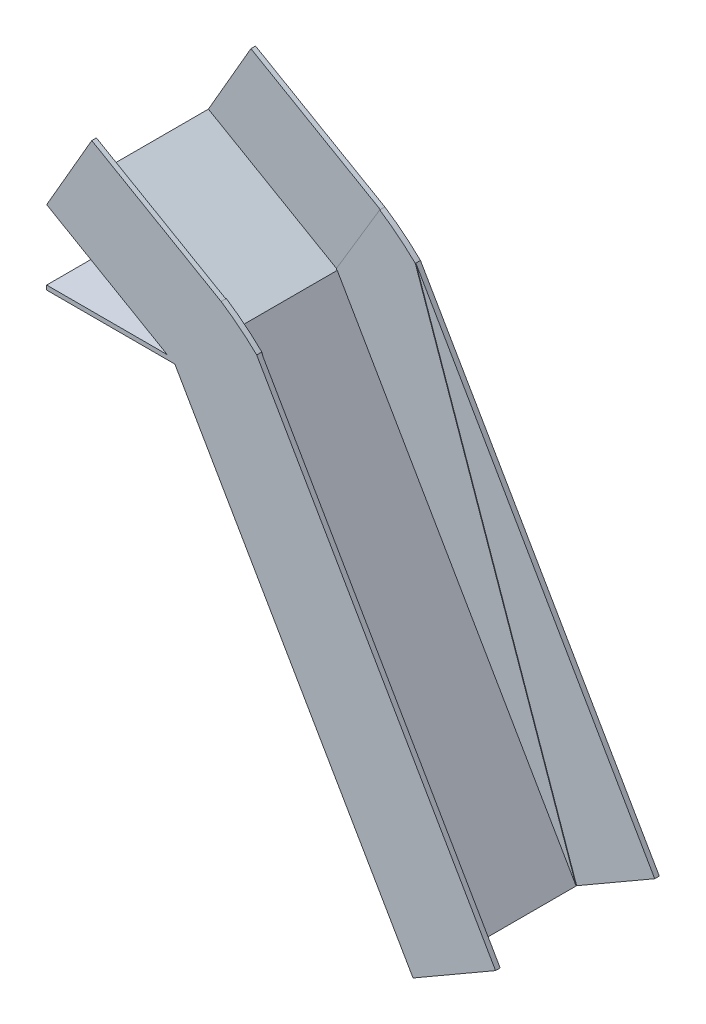
ISO-10303-21;
HEADER;
FILE_DESCRIPTION(('STEP AP214'),'2;1');
FILE_NAME('part.step','',(''),(''),'','','');
FILE_SCHEMA(('AUTOMOTIVE_DESIGN { 1 0 10303 214 1 1 1 1 }'));
ENDSEC;
DATA;
#1=APPLICATION_CONTEXT('core data for automotive mechanical design processes');
#2=APPLICATION_PROTOCOL_DEFINITION('international standard','automotive_design',2000,#1);
#3=PRODUCT_CONTEXT('',#1,'mechanical');
#4=PRODUCT('Part','Part','',(#3));
#5=PRODUCT_RELATED_PRODUCT_CATEGORY('part','',(#4));
#6=PRODUCT_DEFINITION_FORMATION('','',#4);
#7=PRODUCT_DEFINITION_CONTEXT('part definition',#1,'design');
#8=PRODUCT_DEFINITION('design','',#6,#7);
#9=PRODUCT_DEFINITION_SHAPE('','',#8);
#10=(LENGTH_UNIT() NAMED_UNIT(*) SI_UNIT(.MILLI.,.METRE.));
#11=(NAMED_UNIT(*) PLANE_ANGLE_UNIT() SI_UNIT($,.RADIAN.));
#12=(NAMED_UNIT(*) SI_UNIT($,.STERADIAN.) SOLID_ANGLE_UNIT());
#13=UNCERTAINTY_MEASURE_WITH_UNIT(LENGTH_MEASURE(1.E-05),#10,'distance_accuracy_value','');
#14=(GEOMETRIC_REPRESENTATION_CONTEXT(3) GLOBAL_UNCERTAINTY_ASSIGNED_CONTEXT((#13)) GLOBAL_UNIT_ASSIGNED_CONTEXT((#10,
#11,#12)) REPRESENTATION_CONTEXT('',''));
#15=CARTESIAN_POINT('',(0.,0.,0.));
#16=DIRECTION('',(0.,0.,1.));
#17=DIRECTION('',(1.,0.,0.));
#18=AXIS2_PLACEMENT_3D('',#15,#16,#17);
#19=CARTESIAN_POINT('',(78.5519145362399,140.150656940351,-20.291005359564));
#20=DIRECTION('',(-0.500000000000001,0.866025403784438,0.));
#21=DIRECTION('',(-0.866025403784438,-0.500000000000001,0.));
#22=AXIS2_PLACEMENT_3D('',#19,#20,#21);
#23=PLANE('',#22);
#24=DIRECTION('',(-0.866025403784442,-0.499999999999995,0.));
#25=VECTOR('',#24,1.);
#26=CARTESIAN_POINT('',(48.2410254037845,122.650656940351,-20.0797939674139));
#27=LINE('',#26,#25);
#28=CARTESIAN_POINT('',(78.5519145362399,140.150656940351,-20.0797939674139));
#29=VERTEX_POINT('',#28);
#30=CARTESIAN_POINT('',(46.5089745962156,121.650656940351,-20.0797939674139));
#31=VERTEX_POINT('',#30);
#32=EDGE_CURVE('E397',#29,#31,#27,.T.);
#33=ORIENTED_EDGE('',*,*,#32,.F.);
#34=DIRECTION('',(0.,0.,-1.));
#35=VECTOR('',#34,1.);
#36=CARTESIAN_POINT('',(78.5519145362399,140.150656940351,-20.291005359564));
#37=LINE('',#36,#35);
#38=CARTESIAN_POINT('',(78.5519145362399,140.150656940351,-18.291005359564));
#39=VERTEX_POINT('',#38);
#40=EDGE_CURVE('E436',#39,#29,#37,.T.);
#41=ORIENTED_EDGE('',*,*,#40,.F.);
#42=DIRECTION('',(-0.866025403784438,-0.500000000000001,0.));
#43=VECTOR('',#42,1.);
#44=CARTESIAN_POINT('',(78.5519145362399,140.150656940351,-18.291005359564));
#45=LINE('',#44,#43);
#46=CARTESIAN_POINT('',(48.2410254037845,122.650656940351,-18.2910053595639));
#47=VERTEX_POINT('',#46);
#48=EDGE_CURVE('E432',#39,#47,#45,.T.);
#49=ORIENTED_EDGE('',*,*,#48,.T.);
#50=DIRECTION('',(0.,0.,-1.));
#51=VECTOR('',#50,1.);
#52=CARTESIAN_POINT('',(48.2410254037845,122.650656940351,-18.0797939674139));
#53=LINE('',#52,#51);
#54=CARTESIAN_POINT('',(48.2410254037845,122.650656940351,-18.0797939674139));
#55=VERTEX_POINT('',#54);
#56=EDGE_CURVE('E409',#55,#47,#53,.T.);
#57=ORIENTED_EDGE('',*,*,#56,.F.);
#58=DIRECTION('',(0.,0.,-1.));
#59=VECTOR('',#58,1.);
#60=CARTESIAN_POINT('',(48.2410254037845,122.650656940351,41.7107353410038));
#61=LINE('',#60,#59);
#62=CARTESIAN_POINT('',(48.2410254037845,122.650656940351,41.5012646494215));
#63=VERTEX_POINT('',#62);
#64=EDGE_CURVE('E526',#63,#55,#61,.T.);
#65=ORIENTED_EDGE('',*,*,#64,.F.);
#66=CARTESIAN_POINT('',(48.2410254037845,122.650656940351,41.7107353410038));
#67=VERTEX_POINT('',#66);
#68=EDGE_CURVE('E532',#67,#63,#61,.T.);
#69=ORIENTED_EDGE('',*,*,#68,.F.);
#70=DIRECTION('',(-0.866025403784438,-0.500000000000001,0.));
#71=VECTOR('',#70,1.);
#72=CARTESIAN_POINT('',(78.5519145362399,140.150656940351,41.7107353410038));
#73=LINE('',#72,#71);
#74=CARTESIAN_POINT('',(78.5519145362399,140.150656940351,41.7107353410038));
#75=VERTEX_POINT('',#74);
#76=EDGE_CURVE('E308',#75,#67,#73,.T.);
#77=ORIENTED_EDGE('',*,*,#76,.F.);
#78=DIRECTION('',(0.,0.,-1.));
#79=VECTOR('',#78,1.);
#80=CARTESIAN_POINT('',(78.5519145362399,140.150656940351,41.7107353410038));
#81=LINE('',#80,#79);
#82=CARTESIAN_POINT('',(78.5519145362399,140.150656940351,43.5012646494215));
#83=VERTEX_POINT('',#82);
#84=EDGE_CURVE('E305',#83,#75,#81,.T.);
#85=ORIENTED_EDGE('',*,*,#84,.F.);
#86=DIRECTION('',(0.866025403784439,0.5,0.));
#87=VECTOR('',#86,1.);
#88=CARTESIAN_POINT('',(46.5089745962156,121.650656940351,43.5012646494215));
#89=LINE('',#88,#87);
#90=CARTESIAN_POINT('',(46.5089745962156,121.650656940351,43.5012646494215));
#91=VERTEX_POINT('',#90);
#92=EDGE_CURVE('E321',#91,#83,#89,.T.);
#93=ORIENTED_EDGE('',*,*,#92,.F.);
#94=DIRECTION('',(0.,0.,-1.));
#95=VECTOR('',#94,1.);
#96=CARTESIAN_POINT('',(46.5089745962156,121.650656940351,-18.0797939674139));
#97=LINE('',#96,#95);
#98=EDGE_CURVE('E396',#91,#31,#97,.T.);
#99=ORIENTED_EDGE('',*,*,#98,.T.);
#100=EDGE_LOOP('',(#33,#41,#49,#57,#65,#69,#77,#85,#93,#99));
#101=FACE_BOUND('',#100,.T.);
#102=ADVANCED_FACE('F80',(#101),#23,.F.);
#103=CARTESIAN_POINT('',(119.600950535891,69.0516409872319,0.));
#104=DIRECTION('',(-0.866025403784438,-0.500000000000001,0.));
#105=DIRECTION('',(0.500000000000001,-0.866025403784438,0.));
#106=AXIS2_PLACEMENT_3D('',#103,#104,#105);
#107=PLANE('',#106);
#108=DIRECTION('',(0.500000000000001,-0.866025403784438,0.));
#109=VECTOR('',#108,1.);
#110=CARTESIAN_POINT('',(119.600950535891,69.0516409872319,-20.0797939674139));
#111=LINE('',#110,#109);
#112=CARTESIAN_POINT('',(-14.1980854863144,300.798369364335,-20.0797939674139));
#113=VERTEX_POINT('',#112);
#114=EDGE_CURVE('E611',#113,#29,#111,.T.);
#115=ORIENTED_EDGE('',*,*,#114,.F.);
#116=DIRECTION('',(0.,0.,-1.));
#117=VECTOR('',#116,1.);
#118=CARTESIAN_POINT('',(-14.1980854863144,300.798369364335,-18.0797939674139));
#119=LINE('',#118,#117);
#120=CARTESIAN_POINT('',(-14.1980854863144,300.798369364335,-18.2910053595639));
#121=VERTEX_POINT('',#120);
#122=EDGE_CURVE('E420',#121,#113,#119,.T.);
#123=ORIENTED_EDGE('',*,*,#122,.F.);
#124=DIRECTION('',(0.500000000000001,-0.866025403784438,0.));
#125=VECTOR('',#124,1.);
#126=CARTESIAN_POINT('',(-14.1980854637607,300.798369342365,-18.2910053595639));
#127=LINE('',#126,#125);
#128=EDGE_CURVE('E440',#121,#39,#127,.T.);
#129=ORIENTED_EDGE('',*,*,#128,.T.);
#130=ORIENTED_EDGE('',*,*,#40,.T.);
#131=EDGE_LOOP('',(#115,#123,#129,#130));
#132=FACE_BOUND('',#131,.T.);
#133=ADVANCED_FACE('F82',(#132),#107,.F.);
#134=CARTESIAN_POINT('',(-45.9730762113533,283.538488978697,58.5012646494215));
#135=DIRECTION('',(0.,-1.,0.));
#136=DIRECTION('',(0.,0.,-1.));
#137=AXIS2_PLACEMENT_3D('',#134,#135,#136);
#138=PLANE('',#137);
#139=DIRECTION('',(1.,0.,0.));
#140=VECTOR('',#139,1.);
#141=CARTESIAN_POINT('',(-45.9730762113533,283.538488978697,-20.0797939674139));
#142=LINE('',#141,#140);
#143=CARTESIAN_POINT('',(-95.742869732382,283.538488978697,-20.0797939674139));
#144=VERTEX_POINT('',#143);
#145=CARTESIAN_POINT('',(-48.9248740062396,283.538488978697,-20.0797939674139));
#146=VERTEX_POINT('',#145);
#147=EDGE_CURVE('E252',#144,#146,#142,.T.);
#148=ORIENTED_EDGE('',*,*,#147,.F.);
#149=DIRECTION('',(0.,0.,-1.));
#150=VECTOR('',#149,1.);
#151=CARTESIAN_POINT('',(-95.742869732382,283.538488978697,58.5012646494215));
#152=LINE('',#151,#150);
#153=CARTESIAN_POINT('',(-95.742869732382,283.538488978697,43.5012646494215));
#154=VERTEX_POINT('',#153);
#155=EDGE_CURVE('E250',#154,#144,#152,.T.);
#156=ORIENTED_EDGE('',*,*,#155,.F.);
#157=DIRECTION('',(1.,0.,0.));
#158=VECTOR('',#157,1.);
#159=CARTESIAN_POINT('',(-45.9730762113533,283.538488978697,43.5012646494215));
#160=LINE('',#159,#158);
#161=CARTESIAN_POINT('',(-48.9248740062395,283.538488978697,43.5012646494215));
#162=VERTEX_POINT('',#161);
#163=EDGE_CURVE('E265',#154,#162,#160,.T.);
#164=ORIENTED_EDGE('',*,*,#163,.T.);
#165=DIRECTION('',(0.,0.,1.));
#166=VECTOR('',#165,1.);
#167=CARTESIAN_POINT('',(-48.9248740062395,283.538488978697,-18.2892646589962));
#168=LINE('',#167,#166);
#169=EDGE_CURVE('E89',#146,#162,#168,.T.);
#170=ORIENTED_EDGE('',*,*,#169,.F.);
#171=EDGE_LOOP('',(#148,#156,#164,#170));
#172=FACE_BOUND('',#171,.T.);
#173=ADVANCED_FACE('F602',(#172),#138,.F.);
#174=CARTESIAN_POINT('',(-95.742869732382,283.538488978697,58.5012646494215));
#175=DIRECTION('',(1.,0.,0.));
#176=DIRECTION('',(0.,0.,-1.));
#177=AXIS2_PLACEMENT_3D('',#174,#175,#176);
#178=PLANE('',#177);
#179=DIRECTION('',(0.,1.,0.));
#180=VECTOR('',#179,1.);
#181=CARTESIAN_POINT('',(-95.742869732382,283.538488978697,-20.0797939674139));
#182=LINE('',#181,#180);
#183=CARTESIAN_POINT('',(-95.742869732382,281.834267727226,-20.0797939674139));
#184=VERTEX_POINT('',#183);
#185=EDGE_CURVE('E234',#184,#144,#182,.T.);
#186=ORIENTED_EDGE('',*,*,#185,.F.);
#187=DIRECTION('',(0.,0.,-1.));
#188=VECTOR('',#187,1.);
#189=CARTESIAN_POINT('',(-95.742869732382,281.834267727226,58.5012646494215));
#190=LINE('',#189,#188);
#191=CARTESIAN_POINT('',(-95.742869732382,281.834267727226,43.5012646494215));
#192=VERTEX_POINT('',#191);
#193=EDGE_CURVE('E248',#192,#184,#190,.T.);
#194=ORIENTED_EDGE('',*,*,#193,.F.);
#195=DIRECTION('',(0.,1.,0.));
#196=VECTOR('',#195,1.);
#197=CARTESIAN_POINT('',(-95.742869732382,283.538488978697,43.5012646494215));
#198=LINE('',#197,#196);
#199=EDGE_CURVE('E624',#192,#154,#198,.T.);
#200=ORIENTED_EDGE('',*,*,#199,.T.);
#201=ORIENTED_EDGE('',*,*,#155,.T.);
#202=EDGE_LOOP('',(#186,#194,#200,#201));
#203=FACE_BOUND('',#202,.T.);
#204=ADVANCED_FACE('F246',(#203),#178,.F.);
#205=CARTESIAN_POINT('',(-95.742869732382,281.834267727226,58.5012646494215));
#206=DIRECTION('',(0.,1.,0.));
#207=DIRECTION('',(0.,0.,1.));
#208=AXIS2_PLACEMENT_3D('',#205,#206,#207);
#209=PLANE('',#208);
#210=DIRECTION('',(-1.,0.,0.));
#211=VECTOR('',#210,1.);
#212=CARTESIAN_POINT('',(-95.742869732382,281.834267727226,-20.0797939674139));
#213=LINE('',#212,#211);
#214=CARTESIAN_POINT('',(-45.9730762113533,281.834267727226,-20.0797939674139));
#215=VERTEX_POINT('',#214);
#216=EDGE_CURVE('E13',#215,#184,#213,.T.);
#217=ORIENTED_EDGE('',*,*,#216,.F.);
#218=DIRECTION('',(0.,0.,-1.));
#219=VECTOR('',#218,1.);
#220=CARTESIAN_POINT('',(-45.9730762113533,281.834267727226,-18.0797939674139));
#221=LINE('',#220,#219);
#222=CARTESIAN_POINT('',(-45.9730762113533,281.834267727226,43.5012646494215));
#223=VERTEX_POINT('',#222);
#224=EDGE_CURVE('E424',#223,#215,#221,.T.);
#225=ORIENTED_EDGE('',*,*,#224,.F.);
#226=DIRECTION('',(-1.,0.,0.));
#227=VECTOR('',#226,1.);
#228=CARTESIAN_POINT('',(-95.742869732382,281.834267727226,43.5012646494215));
#229=LINE('',#228,#227);
#230=EDGE_CURVE('E256',#223,#192,#229,.T.);
#231=ORIENTED_EDGE('',*,*,#230,.T.);
#232=ORIENTED_EDGE('',*,*,#193,.T.);
#233=EDGE_LOOP('',(#217,#225,#231,#232));
#234=FACE_BOUND('',#233,.T.);
#235=ADVANCED_FACE('F255',(#234),#209,.F.);
#236=CARTESIAN_POINT('',(-21.1796247806433,306.939694424017,-20.0797939674139));
#237=DIRECTION('',(0.,0.,1.));
#238=DIRECTION('',(1.,0.,0.));
#239=AXIS2_PLACEMENT_3D('',#236,#237,#238);
#240=PLANE('',#239);
#241=DIRECTION('',(0.866025403784489,-0.499999999999913,0.));
#242=VECTOR('',#241,1.);
#243=CARTESIAN_POINT('',(-95.7384480157158,310.56631853479,-20.0797939674139));
#244=LINE('',#243,#242);
#245=CARTESIAN_POINT('',(-95.7384480157158,310.56631853479,-20.0797939674139));
#246=VERTEX_POINT('',#245);
#247=EDGE_CURVE('E459',#246,#146,#244,.T.);
#248=ORIENTED_EDGE('',*,*,#247,.F.);
#249=DIRECTION('',(-0.499999999999913,-0.866025403784489,0.));
#250=VECTOR('',#249,1.);
#251=CARTESIAN_POINT('',(-78.2384480157188,340.877207667247,-20.0797939674139));
#252=LINE('',#251,#250);
#253=CARTESIAN_POINT('',(-78.2384480157188,340.877207667247,-20.0797939674139));
#254=VERTEX_POINT('',#253);
#255=EDGE_CURVE('E511',#254,#246,#252,.T.);
#256=ORIENTED_EDGE('',*,*,#255,.F.);
#257=DIRECTION('',(0.866025403784489,-0.499999999999913,0.));
#258=VECTOR('',#257,1.);
#259=CARTESIAN_POINT('',(-78.2384480157188,340.877207667247,-20.0797939674139));
#260=LINE('',#259,#258);
#261=CARTESIAN_POINT('',(-28.0089745962185,311.877207667252,-20.0797939674139));
#262=VERTEX_POINT('',#261);
#263=EDGE_CURVE('E502',#254,#262,#260,.T.);
#264=ORIENTED_EDGE('',*,*,#263,.T.);
#265=CARTESIAN_POINT('',(-632750.714332759,-774185.566014895,-20.0797939674139));
#266=CARTESIAN_POINT('',(622050.150835275,783267.513299288,-20.0797939674139));
#267=CARTESIAN_POINT('',(-611434.305836913,-791121.701805984,-20.0797939674139));
#268=B_SPLINE_CURVE_WITH_KNOTS('',2,(#265,#266,#267),.UNSPECIFIED.,.F.,.F.,(3,3),(0.,1.),.UNSPECIFIED.);
#269=EDGE_CURVE('E403',#262,#113,#268,.T.);
#270=ORIENTED_EDGE('',*,*,#269,.T.);
#271=ORIENTED_EDGE('',*,*,#114,.T.);
#272=ORIENTED_EDGE('',*,*,#32,.T.);
#273=DIRECTION('',(-0.500000000000001,0.866025403784438,0.));
#274=VECTOR('',#273,1.);
#275=CARTESIAN_POINT('',(46.5089745962156,121.650656940351,-20.0797939674139));
#276=LINE('',#275,#274);
#277=EDGE_CURVE('E238',#31,#215,#276,.T.);
#278=ORIENTED_EDGE('',*,*,#277,.T.);
#279=ORIENTED_EDGE('',*,*,#216,.T.);
#280=ORIENTED_EDGE('',*,*,#185,.T.);
#281=ORIENTED_EDGE('',*,*,#147,.T.);
#282=EDGE_LOOP('',(#248,#256,#264,#270,#271,#272,#278,#279,#280,#281));
#283=FACE_BOUND('',#282,.T.);
#284=ADVANCED_FACE('F233',(#283),#240,.F.);
#285=CARTESIAN_POINT('',(-20.8404462709021,306.668914857744,43.5012646494215));
#286=DIRECTION('',(0.,0.,1.));
#287=DIRECTION('',(1.,0.,0.));
#288=AXIS2_PLACEMENT_3D('',#285,#286,#287);
#289=PLANE('',#288);
#290=DIRECTION('',(-0.499999999999913,-0.866025403784489,0.));
#291=VECTOR('',#290,1.);
#292=CARTESIAN_POINT('',(-78.2384480157188,340.877207667247,43.5012646494215));
#293=LINE('',#292,#291);
#294=CARTESIAN_POINT('',(-78.2384480157188,340.877207667247,43.5012646494215));
#295=VERTEX_POINT('',#294);
#296=CARTESIAN_POINT('',(-95.7384480157158,310.56631853479,43.5012646494215));
#297=VERTEX_POINT('',#296);
#298=EDGE_CURVE('E288',#295,#297,#293,.T.);
#299=ORIENTED_EDGE('',*,*,#298,.T.);
#300=DIRECTION('',(-0.866025403784489,0.499999999999913,0.));
#301=VECTOR('',#300,1.);
#302=CARTESIAN_POINT('',(-45.5089745962155,281.566318534795,43.5012646494215));
#303=LINE('',#302,#301);
#304=EDGE_CURVE('E262',#162,#297,#303,.T.);
#305=ORIENTED_EDGE('',*,*,#304,.F.);
#306=ORIENTED_EDGE('',*,*,#163,.F.);
#307=ORIENTED_EDGE('',*,*,#199,.F.);
#308=ORIENTED_EDGE('',*,*,#230,.F.);
#309=DIRECTION('',(0.500000000000001,-0.866025403784438,0.));
#310=VECTOR('',#309,1.);
#311=CARTESIAN_POINT('',(-45.9730762113533,281.834267727226,43.5012646494215));
#312=LINE('',#311,#310);
#313=EDGE_CURVE('E562',#223,#91,#312,.T.);
#314=ORIENTED_EDGE('',*,*,#313,.T.);
#315=ORIENTED_EDGE('',*,*,#92,.T.);
#316=DIRECTION('',(0.500000000000001,-0.866025403784438,0.));
#317=VECTOR('',#316,1.);
#318=CARTESIAN_POINT('',(119.600950535891,69.0516409872319,43.5012646494215));
#319=LINE('',#318,#317);
#320=CARTESIAN_POINT('',(-14.1980854637603,300.798369342364,43.5012646494215));
#321=VERTEX_POINT('',#320);
#322=EDGE_CURVE('E258',#321,#83,#319,.T.);
#323=ORIENTED_EDGE('',*,*,#322,.F.);
#324=CARTESIAN_POINT('',(-14.1980854637603,300.798369342364,43.5012646494215));
#325=CARTESIAN_POINT('',(-20.5773625118148,307.00004121068,43.5012646494215));
#326=CARTESIAN_POINT('',(-28.0089745962185,311.877207667252,43.5012646494215));
#327=B_SPLINE_CURVE_WITH_KNOTS('',2,(#324,#325,#326),.UNSPECIFIED.,.F.,.F.,(3,3),(0.,1.),.UNSPECIFIED.);
#328=CARTESIAN_POINT('',(-28.0089745962185,311.877207667252,43.5012646494215));
#329=VERTEX_POINT('',#328);
#330=EDGE_CURVE('E312',#321,#329,#327,.T.);
#331=ORIENTED_EDGE('',*,*,#330,.T.);
#332=DIRECTION('',(-0.866025403784489,0.499999999999913,0.));
#333=VECTOR('',#332,1.);
#334=CARTESIAN_POINT('',(-28.0089745962185,311.877207667252,43.5012646494215));
#335=LINE('',#334,#333);
#336=EDGE_CURVE('E281',#329,#295,#335,.T.);
#337=ORIENTED_EDGE('',*,*,#336,.T.);
#338=EDGE_LOOP('',(#299,#305,#306,#307,#308,#314,#315,#323,#331,#337));
#339=FACE_BOUND('',#338,.T.);
#340=ADVANCED_FACE('F356',(#339),#289,.T.);
#341=CARTESIAN_POINT('',(-45.5089745962155,281.566318534795,-18.2892646589962));
#342=DIRECTION('',(-0.499999999999913,-0.866025403784489,0.));
#343=DIRECTION('',(0.,0.,1.));
#344=AXIS2_PLACEMENT_3D('',#341,#342,#343);
#345=PLANE('',#344);
#346=ORIENTED_EDGE('',*,*,#247,.T.);
#347=ORIENTED_EDGE('',*,*,#169,.T.);
#348=ORIENTED_EDGE('',*,*,#304,.T.);
#349=DIRECTION('',(0.,0.,1.));
#350=VECTOR('',#349,1.);
#351=CARTESIAN_POINT('',(-95.7384480157158,310.56631853479,-18.2892646589962));
#352=LINE('',#351,#350);
#353=EDGE_CURVE('E465',#246,#297,#352,.T.);
#354=ORIENTED_EDGE('',*,*,#353,.F.);
#355=EDGE_LOOP('',(#346,#347,#348,#354));
#356=FACE_BOUND('',#355,.T.);
#357=ADVANCED_FACE('F352',(#356),#345,.T.);
#358=CARTESIAN_POINT('',(-14.1980854637607,300.798369342365,-18.2910053595639));
#359=DIRECTION('',(0.,0.,-1.));
#360=DIRECTION('',(0.,1.,0.));
#361=AXIS2_PLACEMENT_3D('',#358,#359,#360);
#362=PLANE('',#361);
#363=ORIENTED_EDGE('',*,*,#128,.F.);
#364=DIRECTION('',(0.330762910747632,-0.943713885069916,0.));
#365=VECTOR('',#364,1.);
#366=CARTESIAN_POINT('',(-14.1980854637605,300.798369342365,-18.2910053595639));
#367=LINE('',#366,#365);
#368=EDGE_CURVE('E415',#121,#47,#367,.T.);
#369=ORIENTED_EDGE('',*,*,#368,.T.);
#370=ORIENTED_EDGE('',*,*,#48,.F.);
#371=EDGE_LOOP('',(#363,#369,#370));
#372=FACE_BOUND('',#371,.T.);
#373=ADVANCED_FACE('F355',(#372),#362,.F.);
#374=CARTESIAN_POINT('',(-14.1980854637603,300.798369342364,-18.0797939674139));
#375=DIRECTION('',(0.943713885069916,0.330762910747632,0.));
#376=DIRECTION('',(-0.330762910747632,0.943713885069916,0.));
#377=AXIS2_PLACEMENT_3D('',#374,#375,#376);
#378=PLANE('',#377);
#379=ORIENTED_EDGE('',*,*,#368,.F.);
#380=CARTESIAN_POINT('',(-14.1980854863144,300.798369364335,-18.0797939674139));
#381=VERTEX_POINT('',#380);
#382=EDGE_CURVE('E416',#381,#121,#119,.T.);
#383=ORIENTED_EDGE('',*,*,#382,.F.);
#384=DIRECTION('',(0.330762910747632,-0.943713885069916,0.));
#385=VECTOR('',#384,1.);
#386=CARTESIAN_POINT('',(-14.1980854637603,300.798369342364,-18.0797939674139));
#387=LINE('',#386,#385);
#388=EDGE_CURVE('E387',#381,#55,#387,.T.);
#389=ORIENTED_EDGE('',*,*,#388,.T.);
#390=ORIENTED_EDGE('',*,*,#56,.T.);
#391=EDGE_LOOP('',(#379,#383,#389,#390));
#392=FACE_BOUND('',#391,.T.);
#393=ADVANCED_FACE('F369',(#392),#378,.T.);
#394=CARTESIAN_POINT('',(-632750.714332759,-774185.566014895,-18.0797939674139));
#395=CARTESIAN_POINT('',(622050.150835275,783267.513299288,-18.0797939674139));
#396=CARTESIAN_POINT('',(-611434.305836913,-791121.701805984,-18.0797939674139));
#397=B_SPLINE_CURVE_WITH_KNOTS('',2,(#394,#395,#396),.UNSPECIFIED.,.F.,.F.,(3,3),(0.,1.),.UNSPECIFIED.);
#398=DIRECTION('',(0.,0.,-1.));
#399=VECTOR('',#398,1.);
#400=SURFACE_OF_LINEAR_EXTRUSION('',#397,#399);
#401=ORIENTED_EDGE('',*,*,#269,.F.);
#402=DIRECTION('',(0.,0.,1.));
#403=VECTOR('',#402,1.);
#404=CARTESIAN_POINT('',(-28.0089745962185,311.877207667252,-20.0797939674139));
#405=LINE('',#404,#403);
#406=CARTESIAN_POINT('',(-28.0089745962185,311.877207667252,-18.2892646589962));
#407=VERTEX_POINT('',#406);
#408=EDGE_CURVE('E104',#262,#407,#405,.T.);
#409=ORIENTED_EDGE('',*,*,#408,.T.);
#410=DIRECTION('',(0.,0.,-1.));
#411=VECTOR('',#410,1.);
#412=CARTESIAN_POINT('',(-28.0089745962185,311.877207667252,-18.0797939674139));
#413=LINE('',#412,#411);
#414=CARTESIAN_POINT('',(-28.0089745962185,311.877207667252,-18.0797939674139));
#415=VERTEX_POINT('',#414);
#416=EDGE_CURVE('E421',#415,#407,#413,.T.);
#417=ORIENTED_EDGE('',*,*,#416,.F.);
#418=EDGE_CURVE('E379',#415,#381,#397,.T.);
#419=ORIENTED_EDGE('',*,*,#418,.T.);
#420=ORIENTED_EDGE('',*,*,#382,.T.);
#421=ORIENTED_EDGE('',*,*,#122,.T.);
#422=EDGE_LOOP('',(#401,#409,#417,#419,#420,#421));
#423=FACE_BOUND('',#422,.T.);
#424=ADVANCED_FACE('F372',(#423),#400,.T.);
#425=CARTESIAN_POINT('',(-45.9730762113533,281.834267727226,-18.0797939674139));
#426=DIRECTION('',(-0.858269112835519,0.513199892783048,0.));
#427=DIRECTION('',(-0.513199892783048,-0.858269112835519,0.));
#428=AXIS2_PLACEMENT_3D('',#425,#426,#427);
#429=PLANE('',#428);
#430=DIRECTION('',(0.,0.,-1.));
#431=VECTOR('',#430,1.);
#432=CARTESIAN_POINT('',(-44.9465561190599,283.551007152371,-18.0797939674139));
#433=LINE('',#432,#431);
#434=CARTESIAN_POINT('',(-44.9465561190599,283.551007152371,-18.0797939674139));
#435=VERTEX_POINT('',#434);
#436=CARTESIAN_POINT('',(-44.9465561190599,283.551007152371,-18.2892646589962));
#437=VERTEX_POINT('',#436);
#438=EDGE_CURVE('E400',#435,#437,#433,.T.);
#439=ORIENTED_EDGE('',*,*,#438,.F.);
#440=DIRECTION('',(0.513199892783048,0.858269112835519,0.));
#441=VECTOR('',#440,1.);
#442=CARTESIAN_POINT('',(-45.9730762113533,281.834267727226,-18.0797939674139));
#443=LINE('',#442,#441);
#444=EDGE_CURVE('E388',#435,#415,#443,.T.);
#445=ORIENTED_EDGE('',*,*,#444,.T.);
#446=ORIENTED_EDGE('',*,*,#416,.T.);
#447=DIRECTION('',(0.513199892783048,0.858269112835519,0.));
#448=VECTOR('',#447,1.);
#449=CARTESIAN_POINT('',(-45.9730762113533,281.834267727226,-18.2892646589962));
#450=LINE('',#449,#448);
#451=EDGE_CURVE('E96',#437,#407,#450,.T.);
#452=ORIENTED_EDGE('',*,*,#451,.F.);
#453=EDGE_LOOP('',(#439,#445,#446,#452));
#454=FACE_BOUND('',#453,.T.);
#455=ADVANCED_FACE('F377',(#454),#429,.T.);
#456=CARTESIAN_POINT('',(46.5089745962156,121.650656940351,-18.0797939674139));
#457=DIRECTION('',(-0.866025403784438,-0.500000000000001,0.));
#458=DIRECTION('',(0.500000000000001,-0.866025403784438,0.));
#459=AXIS2_PLACEMENT_3D('',#456,#457,#458);
#460=PLANE('',#459);
#461=ORIENTED_EDGE('',*,*,#224,.T.);
#462=ORIENTED_EDGE('',*,*,#277,.F.);
#463=ORIENTED_EDGE('',*,*,#98,.F.);
#464=ORIENTED_EDGE('',*,*,#313,.F.);
#465=EDGE_LOOP('',(#461,#462,#463,#464));
#466=FACE_BOUND('',#465,.T.);
#467=ADVANCED_FACE('F365',(#466),#460,.T.);
#468=CARTESIAN_POINT('',(-21.1796247806433,306.939694424017,-18.0797939674139));
#469=DIRECTION('',(0.,0.,1.));
#470=DIRECTION('',(1.,0.,0.));
#471=AXIS2_PLACEMENT_3D('',#468,#469,#470);
#472=PLANE('',#471);
#473=DIRECTION('',(-0.500000000000001,0.866025403784438,0.));
#474=VECTOR('',#473,1.);
#475=CARTESIAN_POINT('',(-48.9136311922412,290.927458356574,-18.0797939674139));
#476=LINE('',#475,#474);
#477=CARTESIAN_POINT('',(-44.5089745962156,283.298369342364,-18.0797939674139));
#478=VERTEX_POINT('',#477);
#479=EDGE_CURVE('E447',#55,#478,#476,.T.);
#480=ORIENTED_EDGE('',*,*,#479,.F.);
#481=ORIENTED_EDGE('',*,*,#388,.F.);
#482=ORIENTED_EDGE('',*,*,#418,.F.);
#483=ORIENTED_EDGE('',*,*,#444,.F.);
#484=DIRECTION('',(-0.866025403784489,0.499999999999913,0.));
#485=VECTOR('',#484,1.);
#486=CARTESIAN_POINT('',(-37.2489562844518,279.106795815747,-18.0797939674139));
#487=LINE('',#486,#485);
#488=EDGE_CURVE('E443',#478,#435,#487,.T.);
#489=ORIENTED_EDGE('',*,*,#488,.F.);
#490=EDGE_LOOP('',(#480,#481,#482,#483,#489));
#491=FACE_BOUND('',#490,.T.);
#492=ADVANCED_FACE('F362',(#491),#472,.T.);
#493=CARTESIAN_POINT('',(48.2410254037845,122.650656940351,41.5012646494215));
#494=DIRECTION('',(0.943713885069916,0.330762910747632,0.));
#495=DIRECTION('',(-0.330762910747632,0.943713885069916,0.));
#496=AXIS2_PLACEMENT_3D('',#493,#494,#495);
#497=PLANE('',#496);
#498=DIRECTION('',(0.,0.,1.));
#499=VECTOR('',#498,1.);
#500=CARTESIAN_POINT('',(-14.1980854637603,300.798369342364,41.5012646494215));
#501=LINE('',#500,#499);
#502=CARTESIAN_POINT('',(-14.1980854637603,300.798369342364,41.5012646494215));
#503=VERTEX_POINT('',#502);
#504=CARTESIAN_POINT('',(-14.1980854637603,300.798369342364,41.7107353410038));
#505=VERTEX_POINT('',#504);
#506=EDGE_CURVE('E484',#503,#505,#501,.T.);
#507=ORIENTED_EDGE('',*,*,#506,.T.);
#508=DIRECTION('',(0.330762910747632,-0.943713885069916,0.));
#509=VECTOR('',#508,1.);
#510=CARTESIAN_POINT('',(48.2410254037845,122.650656940351,41.7107353410038));
#511=LINE('',#510,#509);
#512=EDGE_CURVE('E545',#505,#67,#511,.T.);
#513=ORIENTED_EDGE('',*,*,#512,.T.);
#514=ORIENTED_EDGE('',*,*,#68,.T.);
#515=DIRECTION('',(-0.330762910747632,0.943713885069916,0.));
#516=VECTOR('',#515,1.);
#517=CARTESIAN_POINT('',(48.2410254037845,122.650656940351,41.5012646494215));
#518=LINE('',#517,#516);
#519=EDGE_CURVE('E485',#63,#503,#518,.T.);
#520=ORIENTED_EDGE('',*,*,#519,.T.);
#521=EDGE_LOOP('',(#507,#513,#514,#520));
#522=FACE_BOUND('',#521,.T.);
#523=ADVANCED_FACE('F360',(#522),#497,.T.);
#524=CARTESIAN_POINT('',(103.103281974463,27.6264411420559,0.));
#525=DIRECTION('',(0.866025403784438,0.500000000000001,0.));
#526=DIRECTION('',(0.,0.,-1.));
#527=AXIS2_PLACEMENT_3D('',#524,#525,#526);
#528=PLANE('',#527);
#529=ORIENTED_EDGE('',*,*,#64,.T.);
#530=ORIENTED_EDGE('',*,*,#479,.T.);
#531=DIRECTION('',(0.,0.,1.));
#532=VECTOR('',#531,1.);
#533=CARTESIAN_POINT('',(-44.5089745962156,283.298369342364,-18.2892646589962));
#534=LINE('',#533,#532);
#535=CARTESIAN_POINT('',(-44.5089745962156,283.298369342364,41.5012646494215));
#536=VERTEX_POINT('',#535);
#537=EDGE_CURVE('E531',#478,#536,#534,.T.);
#538=ORIENTED_EDGE('',*,*,#537,.T.);
#539=DIRECTION('',(0.500000000000001,-0.866025403784438,0.));
#540=VECTOR('',#539,1.);
#541=CARTESIAN_POINT('',(103.103281974463,27.6264411420559,41.5012646494215));
#542=LINE('',#541,#540);
#543=EDGE_CURVE('E490',#536,#63,#542,.T.);
#544=ORIENTED_EDGE('',*,*,#543,.T.);
#545=EDGE_LOOP('',(#529,#530,#538,#544));
#546=FACE_BOUND('',#545,.T.);
#547=ADVANCED_FACE('F347',(#546),#528,.T.);
#548=CARTESIAN_POINT('',(-95.7384480157158,310.56631853479,-18.2892646589962));
#549=DIRECTION('',(-0.866025403784489,0.499999999999913,0.));
#550=DIRECTION('',(0.,0.,1.));
#551=AXIS2_PLACEMENT_3D('',#548,#549,#550);
#552=PLANE('',#551);
#553=ORIENTED_EDGE('',*,*,#353,.T.);
#554=ORIENTED_EDGE('',*,*,#298,.F.);
#555=DIRECTION('',(0.,0.,-1.));
#556=VECTOR('',#555,1.);
#557=CARTESIAN_POINT('',(-78.2384480157188,340.877207667247,43.5012646494215));
#558=LINE('',#557,#556);
#559=CARTESIAN_POINT('',(-78.2384480157188,340.877207667247,41.7107353410038));
#560=VERTEX_POINT('',#559);
#561=EDGE_CURVE('E269',#295,#560,#558,.T.);
#562=ORIENTED_EDGE('',*,*,#561,.T.);
#563=DIRECTION('',(-0.499999999999913,-0.866025403784489,0.));
#564=VECTOR('',#563,1.);
#565=CARTESIAN_POINT('',(-78.2384480157188,340.877207667247,41.7107353410038));
#566=LINE('',#565,#564);
#567=CARTESIAN_POINT('',(-94.738448015716,312.298369342359,41.7107353410038));
#568=VERTEX_POINT('',#567);
#569=EDGE_CURVE('E284',#560,#568,#566,.T.);
#570=ORIENTED_EDGE('',*,*,#569,.T.);
#571=DIRECTION('',(0.,0.,1.));
#572=VECTOR('',#571,1.);
#573=CARTESIAN_POINT('',(-94.738448015716,312.298369342359,-18.2892646589962));
#574=LINE('',#573,#572);
#575=CARTESIAN_POINT('',(-94.738448015716,312.298369342359,-18.2892646589962));
#576=VERTEX_POINT('',#575);
#577=EDGE_CURVE('E527',#576,#568,#574,.T.);
#578=ORIENTED_EDGE('',*,*,#577,.F.);
#579=DIRECTION('',(-0.499999999999913,-0.866025403784489,0.));
#580=VECTOR('',#579,1.);
#581=CARTESIAN_POINT('',(-78.2384480157188,340.877207667247,-18.2892646589962));
#582=LINE('',#581,#580);
#583=CARTESIAN_POINT('',(-78.2384480157188,340.877207667247,-18.2892646589962));
#584=VERTEX_POINT('',#583);
#585=EDGE_CURVE('E514',#584,#576,#582,.T.);
#586=ORIENTED_EDGE('',*,*,#585,.F.);
#587=DIRECTION('',(0.,0.,-1.));
#588=VECTOR('',#587,1.);
#589=CARTESIAN_POINT('',(-78.2384480157188,340.877207667247,-18.2892646589962));
#590=LINE('',#589,#588);
#591=EDGE_CURVE('E498',#584,#254,#590,.T.);
#592=ORIENTED_EDGE('',*,*,#591,.T.);
#593=ORIENTED_EDGE('',*,*,#255,.T.);
#594=EDGE_LOOP('',(#553,#554,#562,#570,#578,#586,#592,#593));
#595=FACE_BOUND('',#594,.T.);
#596=ADVANCED_FACE('F344',(#595),#552,.T.);
#597=CARTESIAN_POINT('',(-44.5089745962156,283.298369342364,-18.2892646589962));
#598=DIRECTION('',(0.499999999999913,0.866025403784489,0.));
#599=DIRECTION('',(-0.866025403784489,0.499999999999913,0.));
#600=AXIS2_PLACEMENT_3D('',#597,#598,#599);
#601=PLANE('',#600);
#602=ORIENTED_EDGE('',*,*,#488,.T.);
#603=ORIENTED_EDGE('',*,*,#438,.T.);
#604=DIRECTION('',(-0.866025403784489,0.499999999999913,0.));
#605=VECTOR('',#604,1.);
#606=CARTESIAN_POINT('',(-44.5089745962156,283.298369342364,-18.2892646589962));
#607=LINE('',#606,#605);
#608=EDGE_CURVE('E523',#437,#576,#607,.T.);
#609=ORIENTED_EDGE('',*,*,#608,.T.);
#610=ORIENTED_EDGE('',*,*,#577,.T.);
#611=DIRECTION('',(-0.866025403784489,0.499999999999913,0.));
#612=VECTOR('',#611,1.);
#613=CARTESIAN_POINT('',(-44.5089745962156,283.298369342364,41.7107353410038));
#614=LINE('',#613,#612);
#615=CARTESIAN_POINT('',(-44.9465561190599,283.551007152371,41.7107353410038));
#616=VERTEX_POINT('',#615);
#617=EDGE_CURVE('E518',#616,#568,#614,.T.);
#618=ORIENTED_EDGE('',*,*,#617,.F.);
#619=DIRECTION('',(0.,0.,1.));
#620=VECTOR('',#619,1.);
#621=CARTESIAN_POINT('',(-44.9465561190599,283.551007152371,-18.2892646589962));
#622=LINE('',#621,#620);
#623=CARTESIAN_POINT('',(-44.9465561190599,283.551007152371,41.5012646494215));
#624=VERTEX_POINT('',#623);
#625=EDGE_CURVE('E479',#624,#616,#622,.T.);
#626=ORIENTED_EDGE('',*,*,#625,.F.);
#627=DIRECTION('',(0.866025403784489,-0.499999999999913,0.));
#628=VECTOR('',#627,1.);
#629=CARTESIAN_POINT('',(-44.5089745962156,283.298369342364,41.5012646494215));
#630=LINE('',#629,#628);
#631=EDGE_CURVE('E535',#624,#536,#630,.T.);
#632=ORIENTED_EDGE('',*,*,#631,.T.);
#633=ORIENTED_EDGE('',*,*,#537,.F.);
#634=EDGE_LOOP('',(#602,#603,#609,#610,#618,#626,#632,#633));
#635=FACE_BOUND('',#634,.T.);
#636=ADVANCED_FACE('F342',(#635),#601,.T.);
#637=CARTESIAN_POINT('',(-28.0089745962185,311.877207667252,-18.2892646589962));
#638=DIRECTION('',(0.,0.,1.));
#639=DIRECTION('',(1.,0.,0.));
#640=AXIS2_PLACEMENT_3D('',#637,#638,#639);
#641=PLANE('',#640);
#642=ORIENTED_EDGE('',*,*,#608,.F.);
#643=ORIENTED_EDGE('',*,*,#451,.T.);
#644=DIRECTION('',(-0.866025403784489,0.499999999999913,0.));
#645=VECTOR('',#644,1.);
#646=CARTESIAN_POINT('',(-28.0089745962185,311.877207667252,-18.2892646589962));
#647=LINE('',#646,#645);
#648=EDGE_CURVE('E507',#407,#584,#647,.T.);
#649=ORIENTED_EDGE('',*,*,#648,.T.);
#650=ORIENTED_EDGE('',*,*,#585,.T.);
#651=EDGE_LOOP('',(#642,#643,#649,#650));
#652=FACE_BOUND('',#651,.T.);
#653=ADVANCED_FACE('F338',(#652),#641,.T.);
#654=CARTESIAN_POINT('',(128.04454870153,221.779663983329,-61.7905293084177));
#655=DIRECTION('',(-0.499999999999913,-0.866025403784489,0.));
#656=DIRECTION('',(0.866025403784489,-0.499999999999913,0.));
#657=AXIS2_PLACEMENT_3D('',#654,#655,#656);
#658=PLANE('',#657);
#659=ORIENTED_EDGE('',*,*,#591,.F.);
#660=ORIENTED_EDGE('',*,*,#648,.F.);
#661=ORIENTED_EDGE('',*,*,#408,.F.);
#662=ORIENTED_EDGE('',*,*,#263,.F.);
#663=EDGE_LOOP('',(#659,#660,#661,#662));
#664=FACE_BOUND('',#663,.T.);
#665=ADVANCED_FACE('F335',(#664),#658,.F.);
#666=CARTESIAN_POINT('',(-28.0089745962185,311.877207667252,41.5012646494215));
#667=DIRECTION('',(-0.858269112835519,0.513199892783048,0.));
#668=DIRECTION('',(-0.513199892783048,-0.858269112835519,0.));
#669=AXIS2_PLACEMENT_3D('',#666,#667,#668);
#670=PLANE('',#669);
#671=DIRECTION('',(-0.513199892783048,-0.858269112835519,0.));
#672=VECTOR('',#671,1.);
#673=CARTESIAN_POINT('',(-28.0089745962185,311.877207667252,41.7107353410038));
#674=LINE('',#673,#672);
#675=CARTESIAN_POINT('',(-28.0089745962185,311.877207667252,41.7107353410038));
#676=VERTEX_POINT('',#675);
#677=EDGE_CURVE('E291',#676,#616,#674,.T.);
#678=ORIENTED_EDGE('',*,*,#677,.F.);
#679=DIRECTION('',(0.,0.,1.));
#680=VECTOR('',#679,1.);
#681=CARTESIAN_POINT('',(-28.0089745962185,311.877207667252,41.5012646494215));
#682=LINE('',#681,#680);
#683=CARTESIAN_POINT('',(-28.0089745962185,311.877207667252,41.5012646494215));
#684=VERTEX_POINT('',#683);
#685=EDGE_CURVE('E476',#684,#676,#682,.T.);
#686=ORIENTED_EDGE('',*,*,#685,.F.);
#687=DIRECTION('',(-0.513199892783048,-0.858269112835519,0.));
#688=VECTOR('',#687,1.);
#689=CARTESIAN_POINT('',(-28.0089745962185,311.877207667252,41.5012646494215));
#690=LINE('',#689,#688);
#691=EDGE_CURVE('E320',#684,#624,#690,.T.);
#692=ORIENTED_EDGE('',*,*,#691,.T.);
#693=ORIENTED_EDGE('',*,*,#625,.T.);
#694=EDGE_LOOP('',(#678,#686,#692,#693));
#695=FACE_BOUND('',#694,.T.);
#696=ADVANCED_FACE('F332',(#695),#670,.T.);
#697=CARTESIAN_POINT('',(-14.1980854637603,300.798369342364,41.5012646494215));
#698=CARTESIAN_POINT('',(-20.5773625118148,307.00004121068,41.5012646494215));
#699=CARTESIAN_POINT('',(-28.0089745962185,311.877207667252,41.5012646494215));
#700=B_SPLINE_CURVE_WITH_KNOTS('',2,(#697,#698,#699),.UNSPECIFIED.,.F.,.F.,(3,3),(0.,1.),.UNSPECIFIED.);
#701=DIRECTION('',(0.,0.,1.));
#702=VECTOR('',#701,1.);
#703=SURFACE_OF_LINEAR_EXTRUSION('',#700,#702);
#704=ORIENTED_EDGE('',*,*,#330,.F.);
#705=DIRECTION('',(0.,0.,1.));
#706=VECTOR('',#705,1.);
#707=CARTESIAN_POINT('',(-14.1980854637603,300.798369342364,41.7107353410038));
#708=LINE('',#707,#706);
#709=EDGE_CURVE('E301',#505,#321,#708,.T.);
#710=ORIENTED_EDGE('',*,*,#709,.F.);
#711=ORIENTED_EDGE('',*,*,#506,.F.);
#712=EDGE_CURVE('E313',#503,#684,#700,.T.);
#713=ORIENTED_EDGE('',*,*,#712,.T.);
#714=ORIENTED_EDGE('',*,*,#685,.T.);
#715=DIRECTION('',(0.,0.,1.));
#716=VECTOR('',#715,1.);
#717=CARTESIAN_POINT('',(-28.0089745962185,311.877207667252,41.7107353410038));
#718=LINE('',#717,#716);
#719=EDGE_CURVE('E277',#676,#329,#718,.T.);
#720=ORIENTED_EDGE('',*,*,#719,.T.);
#721=EDGE_LOOP('',(#704,#710,#711,#713,#714,#720));
#722=FACE_BOUND('',#721,.T.);
#723=ADVANCED_FACE('F327',(#722),#703,.T.);
#724=CARTESIAN_POINT('',(-20.8404462709021,306.668914857744,41.5012646494215));
#725=DIRECTION('',(0.,0.,1.));
#726=DIRECTION('',(1.,0.,0.));
#727=AXIS2_PLACEMENT_3D('',#724,#725,#726);
#728=PLANE('',#727);
#729=ORIENTED_EDGE('',*,*,#543,.F.);
#730=ORIENTED_EDGE('',*,*,#631,.F.);
#731=ORIENTED_EDGE('',*,*,#691,.F.);
#732=ORIENTED_EDGE('',*,*,#712,.F.);
#733=ORIENTED_EDGE('',*,*,#519,.F.);
#734=EDGE_LOOP('',(#729,#730,#731,#732,#733));
#735=FACE_BOUND('',#734,.T.);
#736=ADVANCED_FACE('F331',(#735),#728,.F.);
#737=CARTESIAN_POINT('',(-14.1980854637603,300.798369342364,41.7107353410038));
#738=DIRECTION('',(0.,0.,1.));
#739=DIRECTION('',(1.,0.,0.));
#740=AXIS2_PLACEMENT_3D('',#737,#738,#739);
#741=PLANE('',#740);
#742=ORIENTED_EDGE('',*,*,#512,.F.);
#743=DIRECTION('',(-0.500000000000001,0.866025403784438,0.));
#744=VECTOR('',#743,1.);
#745=CARTESIAN_POINT('',(-14.1980854637603,300.798369342364,41.7107353410038));
#746=LINE('',#745,#744);
#747=EDGE_CURVE('E297',#75,#505,#746,.T.);
#748=ORIENTED_EDGE('',*,*,#747,.F.);
#749=ORIENTED_EDGE('',*,*,#76,.T.);
#750=EDGE_LOOP('',(#742,#748,#749));
#751=FACE_BOUND('',#750,.T.);
#752=ADVANCED_FACE('F578',(#751),#741,.F.);
#753=CARTESIAN_POINT('',(119.600950535891,69.0516409872319,0.));
#754=DIRECTION('',(-0.866025403784438,-0.500000000000001,0.));
#755=DIRECTION('',(0.500000000000001,-0.866025403784438,0.));
#756=AXIS2_PLACEMENT_3D('',#753,#754,#755);
#757=PLANE('',#756);
#758=ORIENTED_EDGE('',*,*,#709,.T.);
#759=ORIENTED_EDGE('',*,*,#322,.T.);
#760=ORIENTED_EDGE('',*,*,#84,.T.);
#761=ORIENTED_EDGE('',*,*,#747,.T.);
#762=EDGE_LOOP('',(#758,#759,#760,#761));
#763=FACE_BOUND('',#762,.T.);
#764=ADVANCED_FACE('F573',(#763),#757,.F.);
#765=CARTESIAN_POINT('',(-78.2384480157188,340.877207667247,41.7107353410038));
#766=DIRECTION('',(0.,0.,-1.));
#767=DIRECTION('',(-1.,0.,0.));
#768=AXIS2_PLACEMENT_3D('',#765,#766,#767);
#769=PLANE('',#768);
#770=ORIENTED_EDGE('',*,*,#677,.T.);
#771=ORIENTED_EDGE('',*,*,#617,.T.);
#772=ORIENTED_EDGE('',*,*,#569,.F.);
#773=DIRECTION('',(0.866025403784489,-0.499999999999913,0.));
#774=VECTOR('',#773,1.);
#775=CARTESIAN_POINT('',(-78.2384480157188,340.877207667247,41.7107353410038));
#776=LINE('',#775,#774);
#777=EDGE_CURVE('E273',#560,#676,#776,.T.);
#778=ORIENTED_EDGE('',*,*,#777,.T.);
#779=EDGE_LOOP('',(#770,#771,#772,#778));
#780=FACE_BOUND('',#779,.T.);
#781=ADVANCED_FACE('F471',(#780),#769,.T.);
#782=CARTESIAN_POINT('',(128.04454870153,221.779663983329,0.));
#783=DIRECTION('',(-0.499999999999913,-0.866025403784489,0.));
#784=DIRECTION('',(0.866025403784489,-0.499999999999913,0.));
#785=AXIS2_PLACEMENT_3D('',#782,#783,#784);
#786=PLANE('',#785);
#787=ORIENTED_EDGE('',*,*,#561,.F.);
#788=ORIENTED_EDGE('',*,*,#336,.F.);
#789=ORIENTED_EDGE('',*,*,#719,.F.);
#790=ORIENTED_EDGE('',*,*,#777,.F.);
#791=EDGE_LOOP('',(#787,#788,#789,#790));
#792=FACE_BOUND('',#791,.T.);
#793=ADVANCED_FACE('F468',(#792),#786,.F.);
#794=CLOSED_SHELL('',(#102,#133,#173,#204,#235,#284,#340,#357,#373,#393,#424,#455,#467,#492,
#523,#547,#596,#636,#653,#665,#696,#723,#736,#752,#764,#781,#793));
#795=MANIFOLD_SOLID_BREP('B2',#794);
#796=ADVANCED_BREP_SHAPE_REPRESENTATION('',(#18,#795),#14);
#797=SHAPE_DEFINITION_REPRESENTATION(#9,#796);
ENDSEC;
END-ISO-10303-21;
